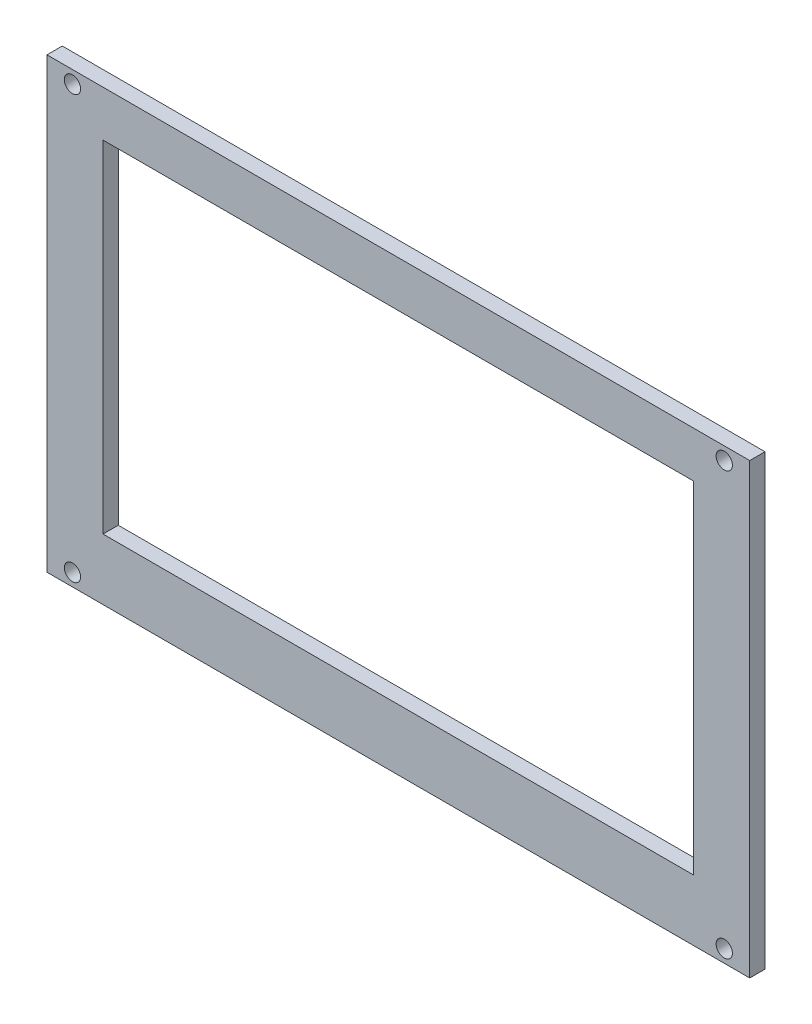
ISO-10303-21;
HEADER;
FILE_DESCRIPTION(('STEP AP214'),'2;1');
FILE_NAME('part.step','',(''),(''),'','','');
FILE_SCHEMA(('AUTOMOTIVE_DESIGN { 1 0 10303 214 1 1 1 1 }'));
ENDSEC;
DATA;
#1=APPLICATION_CONTEXT('core data for automotive mechanical design processes');
#2=APPLICATION_PROTOCOL_DEFINITION('international standard','automotive_design',2000,#1);
#3=PRODUCT_CONTEXT('',#1,'mechanical');
#4=PRODUCT('Part','Part','',(#3));
#5=PRODUCT_RELATED_PRODUCT_CATEGORY('part','',(#4));
#6=PRODUCT_DEFINITION_FORMATION('','',#4);
#7=PRODUCT_DEFINITION_CONTEXT('part definition',#1,'design');
#8=PRODUCT_DEFINITION('design','',#6,#7);
#9=PRODUCT_DEFINITION_SHAPE('','',#8);
#10=(LENGTH_UNIT() NAMED_UNIT(*) SI_UNIT(.MILLI.,.METRE.));
#11=(NAMED_UNIT(*) PLANE_ANGLE_UNIT() SI_UNIT($,.RADIAN.));
#12=(NAMED_UNIT(*) SI_UNIT($,.STERADIAN.) SOLID_ANGLE_UNIT());
#13=UNCERTAINTY_MEASURE_WITH_UNIT(LENGTH_MEASURE(1.E-05),#10,'distance_accuracy_value','');
#14=(GEOMETRIC_REPRESENTATION_CONTEXT(3) GLOBAL_UNCERTAINTY_ASSIGNED_CONTEXT((#13)) GLOBAL_UNIT_ASSIGNED_CONTEXT((#10,
#11,#12)) REPRESENTATION_CONTEXT('',''));
#15=CARTESIAN_POINT('',(0.,0.,0.));
#16=DIRECTION('',(0.,0.,1.));
#17=DIRECTION('',(1.,0.,0.));
#18=AXIS2_PLACEMENT_3D('',#15,#16,#17);
#19=CARTESIAN_POINT('',(0.,88.,3.));
#20=DIRECTION('',(1.,0.,0.));
#21=DIRECTION('',(0.,1.,0.));
#22=AXIS2_PLACEMENT_3D('',#19,#20,#21);
#23=PLANE('',#22);
#24=DIRECTION('',(0.,-1.,0.));
#25=VECTOR('',#24,1.);
#26=CARTESIAN_POINT('',(0.,88.,0.));
#27=LINE('',#26,#25);
#28=CARTESIAN_POINT('',(0.,88.,0.));
#29=VERTEX_POINT('',#28);
#30=CARTESIAN_POINT('',(0.,0.,0.));
#31=VERTEX_POINT('',#30);
#32=EDGE_CURVE('E113',#29,#31,#27,.T.);
#33=ORIENTED_EDGE('',*,*,#32,.T.);
#34=DIRECTION('',(0.,0.,-1.));
#35=VECTOR('',#34,1.);
#36=CARTESIAN_POINT('',(0.,0.,3.));
#37=LINE('',#36,#35);
#38=CARTESIAN_POINT('',(0.,0.,3.));
#39=VERTEX_POINT('',#38);
#40=EDGE_CURVE('E11',#39,#31,#37,.T.);
#41=ORIENTED_EDGE('',*,*,#40,.F.);
#42=DIRECTION('',(0.,-1.,0.));
#43=VECTOR('',#42,1.);
#44=CARTESIAN_POINT('',(0.,88.,3.));
#45=LINE('',#44,#43);
#46=CARTESIAN_POINT('',(0.,88.,3.));
#47=VERTEX_POINT('',#46);
#48=EDGE_CURVE('E136',#47,#39,#45,.T.);
#49=ORIENTED_EDGE('',*,*,#48,.F.);
#50=DIRECTION('',(0.,0.,-1.));
#51=VECTOR('',#50,1.);
#52=CARTESIAN_POINT('',(0.,88.,3.));
#53=LINE('',#52,#51);
#54=EDGE_CURVE('E146',#47,#29,#53,.T.);
#55=ORIENTED_EDGE('',*,*,#54,.T.);
#56=EDGE_LOOP('',(#33,#41,#49,#55));
#57=FACE_BOUND('',#56,.T.);
#58=ADVANCED_FACE('F35',(#57),#23,.F.);
#59=CARTESIAN_POINT('',(0.,0.,3.));
#60=DIRECTION('',(0.,1.,0.));
#61=DIRECTION('',(0.,0.,1.));
#62=AXIS2_PLACEMENT_3D('',#59,#60,#61);
#63=PLANE('',#62);
#64=DIRECTION('',(1.,0.,0.));
#65=VECTOR('',#64,1.);
#66=CARTESIAN_POINT('',(0.,0.,0.));
#67=LINE('',#66,#65);
#68=CARTESIAN_POINT('',(138.,0.,0.));
#69=VERTEX_POINT('',#68);
#70=EDGE_CURVE('E149',#31,#69,#67,.T.);
#71=ORIENTED_EDGE('',*,*,#70,.T.);
#72=DIRECTION('',(0.,0.,-1.));
#73=VECTOR('',#72,1.);
#74=CARTESIAN_POINT('',(138.,0.,3.));
#75=LINE('',#74,#73);
#76=CARTESIAN_POINT('',(138.,0.,3.));
#77=VERTEX_POINT('',#76);
#78=EDGE_CURVE('E42',#77,#69,#75,.T.);
#79=ORIENTED_EDGE('',*,*,#78,.F.);
#80=DIRECTION('',(1.,0.,0.));
#81=VECTOR('',#80,1.);
#82=CARTESIAN_POINT('',(0.,0.,3.));
#83=LINE('',#82,#81);
#84=EDGE_CURVE('E139',#39,#77,#83,.T.);
#85=ORIENTED_EDGE('',*,*,#84,.F.);
#86=ORIENTED_EDGE('',*,*,#40,.T.);
#87=EDGE_LOOP('',(#71,#79,#85,#86));
#88=FACE_BOUND('',#87,.T.);
#89=ADVANCED_FACE('F177',(#88),#63,.F.);
#90=CARTESIAN_POINT('',(138.,88.,3.));
#91=DIRECTION('',(-1.,0.,0.));
#92=DIRECTION('',(0.,0.,1.));
#93=AXIS2_PLACEMENT_3D('',#90,#91,#92);
#94=PLANE('',#93);
#95=DIRECTION('',(0.,1.,0.));
#96=VECTOR('',#95,1.);
#97=CARTESIAN_POINT('',(138.,88.,0.));
#98=LINE('',#97,#96);
#99=CARTESIAN_POINT('',(138.,88.,0.));
#100=VERTEX_POINT('',#99);
#101=EDGE_CURVE('E151',#69,#100,#98,.T.);
#102=ORIENTED_EDGE('',*,*,#101,.T.);
#103=DIRECTION('',(0.,0.,-1.));
#104=VECTOR('',#103,1.);
#105=CARTESIAN_POINT('',(138.,88.,3.));
#106=LINE('',#105,#104);
#107=CARTESIAN_POINT('',(138.,88.,3.));
#108=VERTEX_POINT('',#107);
#109=EDGE_CURVE('E156',#108,#100,#106,.T.);
#110=ORIENTED_EDGE('',*,*,#109,.F.);
#111=DIRECTION('',(0.,1.,0.));
#112=VECTOR('',#111,1.);
#113=CARTESIAN_POINT('',(138.,88.,3.));
#114=LINE('',#113,#112);
#115=EDGE_CURVE('E142',#77,#108,#114,.T.);
#116=ORIENTED_EDGE('',*,*,#115,.F.);
#117=ORIENTED_EDGE('',*,*,#78,.T.);
#118=EDGE_LOOP('',(#102,#110,#116,#117));
#119=FACE_BOUND('',#118,.T.);
#120=ADVANCED_FACE('F163',(#119),#94,.F.);
#121=CARTESIAN_POINT('',(0.,88.,3.));
#122=DIRECTION('',(0.,-1.,0.));
#123=DIRECTION('',(1.,0.,0.));
#124=AXIS2_PLACEMENT_3D('',#121,#122,#123);
#125=PLANE('',#124);
#126=DIRECTION('',(-1.,0.,0.));
#127=VECTOR('',#126,1.);
#128=CARTESIAN_POINT('',(0.,88.,0.));
#129=LINE('',#128,#127);
#130=EDGE_CURVE('E140',#100,#29,#129,.T.);
#131=ORIENTED_EDGE('',*,*,#130,.T.);
#132=ORIENTED_EDGE('',*,*,#54,.F.);
#133=DIRECTION('',(-1.,0.,0.));
#134=VECTOR('',#133,1.);
#135=CARTESIAN_POINT('',(0.,88.,3.));
#136=LINE('',#135,#134);
#137=EDGE_CURVE('E144',#108,#47,#136,.T.);
#138=ORIENTED_EDGE('',*,*,#137,.F.);
#139=ORIENTED_EDGE('',*,*,#109,.T.);
#140=EDGE_LOOP('',(#131,#132,#138,#139));
#141=FACE_BOUND('',#140,.T.);
#142=ADVANCED_FACE('F170',(#141),#125,.F.);
#143=CARTESIAN_POINT('',(0.,0.,3.));
#144=DIRECTION('',(0.,0.,1.));
#145=DIRECTION('',(1.,0.,0.));
#146=AXIS2_PLACEMENT_3D('',#143,#144,#145);
#147=PLANE('',#146);
#148=CARTESIAN_POINT('',(4.99999999999998,85.5,3.));
#149=DIRECTION('',(0.,0.,1.));
#150=DIRECTION('',(1.,0.,0.));
#151=AXIS2_PLACEMENT_3D('',#148,#149,#150);
#152=CIRCLE('',#151,1.59999999999999);
#153=CARTESIAN_POINT('',(6.59999999999996,85.5,3.));
#154=VERTEX_POINT('',#153);
#155=EDGE_CURVE('E227',#154,#154,#152,.T.);
#156=ORIENTED_EDGE('',*,*,#155,.F.);
#157=EDGE_LOOP('',(#156));
#158=FACE_BOUND('',#157,.T.);
#159=CARTESIAN_POINT('',(133.,85.5,3.));
#160=DIRECTION('',(0.,0.,1.));
#161=DIRECTION('',(1.,0.,0.));
#162=AXIS2_PLACEMENT_3D('',#159,#160,#161);
#163=CIRCLE('',#162,1.59999999999999);
#164=CARTESIAN_POINT('',(134.6,85.5,3.));
#165=VERTEX_POINT('',#164);
#166=EDGE_CURVE('E229',#165,#165,#163,.T.);
#167=ORIENTED_EDGE('',*,*,#166,.F.);
#168=EDGE_LOOP('',(#167));
#169=FACE_BOUND('',#168,.T.);
#170=CARTESIAN_POINT('',(133.,2.5,3.));
#171=DIRECTION('',(0.,0.,1.));
#172=DIRECTION('',(1.,0.,0.));
#173=AXIS2_PLACEMENT_3D('',#170,#171,#172);
#174=CIRCLE('',#173,1.59999999999999);
#175=CARTESIAN_POINT('',(134.6,2.5,3.));
#176=VERTEX_POINT('',#175);
#177=EDGE_CURVE('E237',#176,#176,#174,.T.);
#178=ORIENTED_EDGE('',*,*,#177,.F.);
#179=EDGE_LOOP('',(#178));
#180=FACE_BOUND('',#179,.T.);
#181=CARTESIAN_POINT('',(4.99999999999998,2.5,3.));
#182=DIRECTION('',(0.,0.,1.));
#183=DIRECTION('',(1.,0.,0.));
#184=AXIS2_PLACEMENT_3D('',#181,#182,#183);
#185=CIRCLE('',#184,1.59999999999999);
#186=CARTESIAN_POINT('',(6.59999999999996,2.5,3.));
#187=VERTEX_POINT('',#186);
#188=EDGE_CURVE('E243',#187,#187,#185,.T.);
#189=ORIENTED_EDGE('',*,*,#188,.F.);
#190=EDGE_LOOP('',(#189));
#191=FACE_BOUND('',#190,.T.);
#192=DIRECTION('',(0.,-1.,0.));
#193=VECTOR('',#192,1.);
#194=CARTESIAN_POINT('',(11.,79.,3.));
#195=LINE('',#194,#193);
#196=CARTESIAN_POINT('',(11.,79.,3.));
#197=VERTEX_POINT('',#196);
#198=CARTESIAN_POINT('',(11.,12.,3.));
#199=VERTEX_POINT('',#198);
#200=EDGE_CURVE('E49',#197,#199,#195,.T.);
#201=ORIENTED_EDGE('',*,*,#200,.F.);
#202=DIRECTION('',(-1.,0.,0.));
#203=VECTOR('',#202,1.);
#204=CARTESIAN_POINT('',(11.,79.,3.));
#205=LINE('',#204,#203);
#206=CARTESIAN_POINT('',(127.,79.,3.));
#207=VERTEX_POINT('',#206);
#208=EDGE_CURVE('E107',#207,#197,#205,.T.);
#209=ORIENTED_EDGE('',*,*,#208,.F.);
#210=DIRECTION('',(0.,1.,0.));
#211=VECTOR('',#210,1.);
#212=CARTESIAN_POINT('',(127.,79.,3.));
#213=LINE('',#212,#211);
#214=CARTESIAN_POINT('',(127.,12.,3.));
#215=VERTEX_POINT('',#214);
#216=EDGE_CURVE('E127',#215,#207,#213,.T.);
#217=ORIENTED_EDGE('',*,*,#216,.F.);
#218=DIRECTION('',(1.,0.,0.));
#219=VECTOR('',#218,1.);
#220=CARTESIAN_POINT('',(11.,12.,3.));
#221=LINE('',#220,#219);
#222=EDGE_CURVE('E121',#199,#215,#221,.T.);
#223=ORIENTED_EDGE('',*,*,#222,.F.);
#224=EDGE_LOOP('',(#201,#209,#217,#223));
#225=FACE_BOUND('',#224,.T.);
#226=ORIENTED_EDGE('',*,*,#48,.T.);
#227=ORIENTED_EDGE('',*,*,#84,.T.);
#228=ORIENTED_EDGE('',*,*,#115,.T.);
#229=ORIENTED_EDGE('',*,*,#137,.T.);
#230=EDGE_LOOP('',(#226,#227,#228,#229));
#231=FACE_BOUND('',#230,.T.);
#232=ADVANCED_FACE('F176',(#158,#169,#180,#191,#225,#231),#147,.T.);
#233=CARTESIAN_POINT('',(0.,0.,0.));
#234=DIRECTION('',(0.,0.,1.));
#235=DIRECTION('',(1.,0.,0.));
#236=AXIS2_PLACEMENT_3D('',#233,#234,#235);
#237=PLANE('',#236);
#238=CARTESIAN_POINT('',(4.99999999999998,85.5,0.));
#239=DIRECTION('',(0.,0.,1.));
#240=DIRECTION('',(1.,0.,0.));
#241=AXIS2_PLACEMENT_3D('',#238,#239,#240);
#242=CIRCLE('',#241,1.59999999999999);
#243=CARTESIAN_POINT('',(6.59999999999997,85.5,0.));
#244=VERTEX_POINT('',#243);
#245=EDGE_CURVE('E224',#244,#244,#242,.T.);
#246=ORIENTED_EDGE('',*,*,#245,.T.);
#247=EDGE_LOOP('',(#246));
#248=FACE_BOUND('',#247,.T.);
#249=CARTESIAN_POINT('',(133.,85.5,0.));
#250=DIRECTION('',(0.,0.,1.));
#251=DIRECTION('',(1.,0.,0.));
#252=AXIS2_PLACEMENT_3D('',#249,#250,#251);
#253=CIRCLE('',#252,1.59999999999999);
#254=CARTESIAN_POINT('',(134.6,85.5,0.));
#255=VERTEX_POINT('',#254);
#256=EDGE_CURVE('E234',#255,#255,#253,.T.);
#257=ORIENTED_EDGE('',*,*,#256,.T.);
#258=EDGE_LOOP('',(#257));
#259=FACE_BOUND('',#258,.T.);
#260=CARTESIAN_POINT('',(133.,2.5,0.));
#261=DIRECTION('',(0.,0.,1.));
#262=DIRECTION('',(1.,0.,0.));
#263=AXIS2_PLACEMENT_3D('',#260,#261,#262);
#264=CIRCLE('',#263,1.59999999999999);
#265=CARTESIAN_POINT('',(134.6,2.5,0.));
#266=VERTEX_POINT('',#265);
#267=EDGE_CURVE('E240',#266,#266,#264,.T.);
#268=ORIENTED_EDGE('',*,*,#267,.T.);
#269=EDGE_LOOP('',(#268));
#270=FACE_BOUND('',#269,.T.);
#271=CARTESIAN_POINT('',(4.99999999999998,2.5,0.));
#272=DIRECTION('',(0.,0.,1.));
#273=DIRECTION('',(1.,0.,0.));
#274=AXIS2_PLACEMENT_3D('',#271,#272,#273);
#275=CIRCLE('',#274,1.59999999999999);
#276=CARTESIAN_POINT('',(6.59999999999997,2.5,0.));
#277=VERTEX_POINT('',#276);
#278=EDGE_CURVE('E246',#277,#277,#275,.T.);
#279=ORIENTED_EDGE('',*,*,#278,.T.);
#280=EDGE_LOOP('',(#279));
#281=FACE_BOUND('',#280,.T.);
#282=DIRECTION('',(1.,0.,0.));
#283=VECTOR('',#282,1.);
#284=CARTESIAN_POINT('',(11.,79.,0.));
#285=LINE('',#284,#283);
#286=CARTESIAN_POINT('',(11.,79.,0.));
#287=VERTEX_POINT('',#286);
#288=CARTESIAN_POINT('',(127.,79.,0.));
#289=VERTEX_POINT('',#288);
#290=EDGE_CURVE('E119',#287,#289,#285,.T.);
#291=ORIENTED_EDGE('',*,*,#290,.F.);
#292=DIRECTION('',(0.,1.,0.));
#293=VECTOR('',#292,1.);
#294=CARTESIAN_POINT('',(11.,79.,0.));
#295=LINE('',#294,#293);
#296=CARTESIAN_POINT('',(11.,12.,0.));
#297=VERTEX_POINT('',#296);
#298=EDGE_CURVE('E101',#297,#287,#295,.T.);
#299=ORIENTED_EDGE('',*,*,#298,.F.);
#300=DIRECTION('',(-1.,0.,0.));
#301=VECTOR('',#300,1.);
#302=CARTESIAN_POINT('',(11.,12.,0.));
#303=LINE('',#302,#301);
#304=CARTESIAN_POINT('',(127.,12.,0.));
#305=VERTEX_POINT('',#304);
#306=EDGE_CURVE('E110',#305,#297,#303,.T.);
#307=ORIENTED_EDGE('',*,*,#306,.F.);
#308=DIRECTION('',(0.,-1.,0.));
#309=VECTOR('',#308,1.);
#310=CARTESIAN_POINT('',(127.,79.,0.));
#311=LINE('',#310,#309);
#312=EDGE_CURVE('E57',#289,#305,#311,.T.);
#313=ORIENTED_EDGE('',*,*,#312,.F.);
#314=EDGE_LOOP('',(#291,#299,#307,#313));
#315=FACE_BOUND('',#314,.T.);
#316=ORIENTED_EDGE('',*,*,#32,.F.);
#317=ORIENTED_EDGE('',*,*,#130,.F.);
#318=ORIENTED_EDGE('',*,*,#101,.F.);
#319=ORIENTED_EDGE('',*,*,#70,.F.);
#320=EDGE_LOOP('',(#316,#317,#318,#319));
#321=FACE_BOUND('',#320,.T.);
#322=ADVANCED_FACE('F116',(#248,#259,#270,#281,#315,#321),#237,.F.);
#323=CARTESIAN_POINT('',(11.,79.,-0.00100000000000013));
#324=DIRECTION('',(-1.,0.,0.));
#325=DIRECTION('',(0.,-1.,0.));
#326=AXIS2_PLACEMENT_3D('',#323,#324,#325);
#327=PLANE('',#326);
#328=ORIENTED_EDGE('',*,*,#298,.T.);
#329=DIRECTION('',(0.,0.,1.));
#330=VECTOR('',#329,1.);
#331=CARTESIAN_POINT('',(11.,79.,-0.00100000000000013));
#332=LINE('',#331,#330);
#333=EDGE_CURVE('E114',#287,#197,#332,.T.);
#334=ORIENTED_EDGE('',*,*,#333,.T.);
#335=ORIENTED_EDGE('',*,*,#200,.T.);
#336=DIRECTION('',(0.,0.,1.));
#337=VECTOR('',#336,1.);
#338=CARTESIAN_POINT('',(11.,12.,-0.00100000000000013));
#339=LINE('',#338,#337);
#340=EDGE_CURVE('E97',#297,#199,#339,.T.);
#341=ORIENTED_EDGE('',*,*,#340,.F.);
#342=EDGE_LOOP('',(#328,#334,#335,#341));
#343=FACE_BOUND('',#342,.T.);
#344=ADVANCED_FACE('F99',(#343),#327,.F.);
#345=CARTESIAN_POINT('',(11.,79.,-0.00100000000000013));
#346=DIRECTION('',(0.,1.,0.));
#347=DIRECTION('',(0.,0.,1.));
#348=AXIS2_PLACEMENT_3D('',#345,#346,#347);
#349=PLANE('',#348);
#350=ORIENTED_EDGE('',*,*,#290,.T.);
#351=DIRECTION('',(0.,0.,1.));
#352=VECTOR('',#351,1.);
#353=CARTESIAN_POINT('',(127.,79.,-0.00100000000000013));
#354=LINE('',#353,#352);
#355=EDGE_CURVE('E133',#289,#207,#354,.T.);
#356=ORIENTED_EDGE('',*,*,#355,.T.);
#357=ORIENTED_EDGE('',*,*,#208,.T.);
#358=ORIENTED_EDGE('',*,*,#333,.F.);
#359=EDGE_LOOP('',(#350,#356,#357,#358));
#360=FACE_BOUND('',#359,.T.);
#361=ADVANCED_FACE('F195',(#360),#349,.F.);
#362=CARTESIAN_POINT('',(127.,79.,-0.00100000000000013));
#363=DIRECTION('',(1.,0.,0.));
#364=DIRECTION('',(0.,0.,-1.));
#365=AXIS2_PLACEMENT_3D('',#362,#363,#364);
#366=PLANE('',#365);
#367=ORIENTED_EDGE('',*,*,#312,.T.);
#368=DIRECTION('',(0.,0.,1.));
#369=VECTOR('',#368,1.);
#370=CARTESIAN_POINT('',(127.,12.,-0.00100000000000013));
#371=LINE('',#370,#369);
#372=EDGE_CURVE('E106',#305,#215,#371,.T.);
#373=ORIENTED_EDGE('',*,*,#372,.T.);
#374=ORIENTED_EDGE('',*,*,#216,.T.);
#375=ORIENTED_EDGE('',*,*,#355,.F.);
#376=EDGE_LOOP('',(#367,#373,#374,#375));
#377=FACE_BOUND('',#376,.T.);
#378=ADVANCED_FACE('F199',(#377),#366,.F.);
#379=CARTESIAN_POINT('',(11.,12.,-0.00100000000000013));
#380=DIRECTION('',(0.,-1.,0.));
#381=DIRECTION('',(1.,0.,0.));
#382=AXIS2_PLACEMENT_3D('',#379,#380,#381);
#383=PLANE('',#382);
#384=ORIENTED_EDGE('',*,*,#306,.T.);
#385=ORIENTED_EDGE('',*,*,#340,.T.);
#386=ORIENTED_EDGE('',*,*,#222,.T.);
#387=ORIENTED_EDGE('',*,*,#372,.F.);
#388=EDGE_LOOP('',(#384,#385,#386,#387));
#389=FACE_BOUND('',#388,.T.);
#390=ADVANCED_FACE('F111',(#389),#383,.F.);
#391=CARTESIAN_POINT('',(4.99999999999998,2.5,3.));
#392=DIRECTION('',(0.,0.,1.));
#393=DIRECTION('',(1.,0.,0.));
#394=AXIS2_PLACEMENT_3D('',#391,#392,#393);
#395=CYLINDRICAL_SURFACE('',#394,1.59999999999999);
#396=ORIENTED_EDGE('',*,*,#278,.F.);
#397=EDGE_LOOP('',(#396));
#398=FACE_BOUND('',#397,.T.);
#399=ORIENTED_EDGE('',*,*,#188,.T.);
#400=EDGE_LOOP('',(#399));
#401=FACE_BOUND('',#400,.T.);
#402=ADVANCED_FACE('F198',(#398,#401),#395,.F.);
#403=CARTESIAN_POINT('',(133.,2.5,3.));
#404=DIRECTION('',(0.,0.,1.));
#405=DIRECTION('',(1.,0.,0.));
#406=AXIS2_PLACEMENT_3D('',#403,#404,#405);
#407=CYLINDRICAL_SURFACE('',#406,1.59999999999999);
#408=ORIENTED_EDGE('',*,*,#267,.F.);
#409=EDGE_LOOP('',(#408));
#410=FACE_BOUND('',#409,.T.);
#411=ORIENTED_EDGE('',*,*,#177,.T.);
#412=EDGE_LOOP('',(#411));
#413=FACE_BOUND('',#412,.T.);
#414=ADVANCED_FACE('F207',(#410,#413),#407,.F.);
#415=CARTESIAN_POINT('',(133.,85.5,3.));
#416=DIRECTION('',(0.,0.,1.));
#417=DIRECTION('',(1.,0.,0.));
#418=AXIS2_PLACEMENT_3D('',#415,#416,#417);
#419=CYLINDRICAL_SURFACE('',#418,1.59999999999999);
#420=ORIENTED_EDGE('',*,*,#256,.F.);
#421=EDGE_LOOP('',(#420));
#422=FACE_BOUND('',#421,.T.);
#423=ORIENTED_EDGE('',*,*,#166,.T.);
#424=EDGE_LOOP('',(#423));
#425=FACE_BOUND('',#424,.T.);
#426=ADVANCED_FACE('F211',(#422,#425),#419,.F.);
#427=CARTESIAN_POINT('',(4.99999999999998,85.5,3.));
#428=DIRECTION('',(0.,0.,1.));
#429=DIRECTION('',(1.,0.,0.));
#430=AXIS2_PLACEMENT_3D('',#427,#428,#429);
#431=CYLINDRICAL_SURFACE('',#430,1.59999999999999);
#432=ORIENTED_EDGE('',*,*,#245,.F.);
#433=EDGE_LOOP('',(#432));
#434=FACE_BOUND('',#433,.T.);
#435=ORIENTED_EDGE('',*,*,#155,.T.);
#436=EDGE_LOOP('',(#435));
#437=FACE_BOUND('',#436,.T.);
#438=ADVANCED_FACE('F215',(#434,#437),#431,.F.);
#439=CLOSED_SHELL('',(#58,#89,#120,#142,#232,#322,#344,#361,#378,#390,#402,#414,#426,#438));
#440=MANIFOLD_SOLID_BREP('B2',#439);
#441=ADVANCED_BREP_SHAPE_REPRESENTATION('',(#18,#440),#14);
#442=SHAPE_DEFINITION_REPRESENTATION(#9,#441);
ENDSEC;
END-ISO-10303-21;
